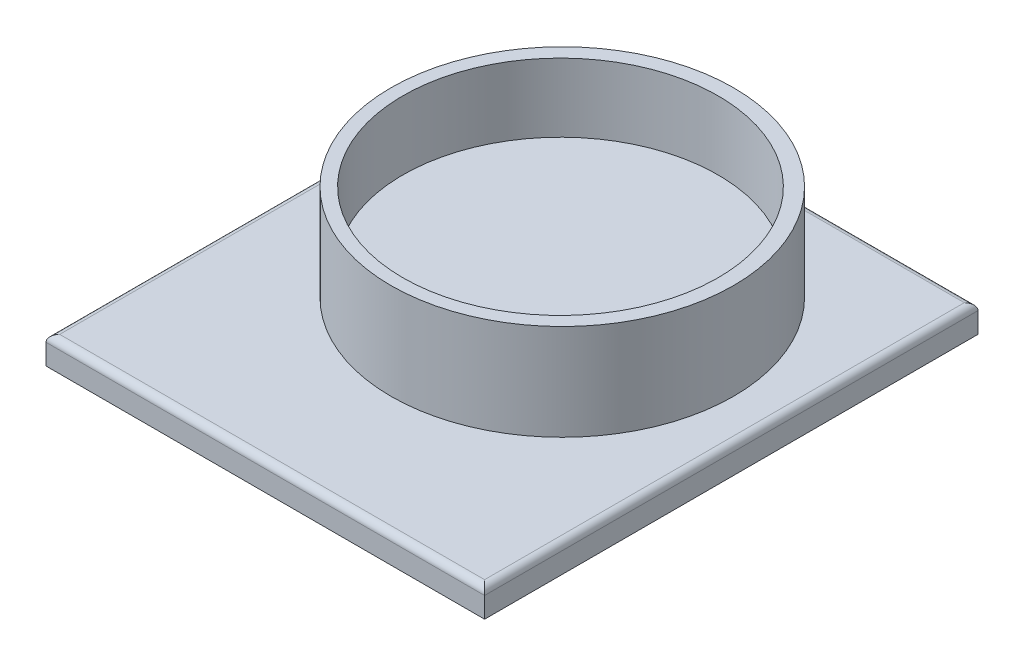
ISO-10303-21;
HEADER;
FILE_DESCRIPTION(('STEP AP214'),'2;1');
FILE_NAME('part.step','',(''),(''),'','','');
FILE_SCHEMA(('AUTOMOTIVE_DESIGN { 1 0 10303 214 1 1 1 1 }'));
ENDSEC;
DATA;
#1=APPLICATION_CONTEXT('core data for automotive mechanical design processes');
#2=APPLICATION_PROTOCOL_DEFINITION('international standard','automotive_design',2000,#1);
#3=PRODUCT_CONTEXT('',#1,'mechanical');
#4=PRODUCT('Part','Part','',(#3));
#5=PRODUCT_RELATED_PRODUCT_CATEGORY('part','',(#4));
#6=PRODUCT_DEFINITION_FORMATION('','',#4);
#7=PRODUCT_DEFINITION_CONTEXT('part definition',#1,'design');
#8=PRODUCT_DEFINITION('design','',#6,#7);
#9=PRODUCT_DEFINITION_SHAPE('','',#8);
#10=(LENGTH_UNIT() NAMED_UNIT(*) SI_UNIT(.MILLI.,.METRE.));
#11=(NAMED_UNIT(*) PLANE_ANGLE_UNIT() SI_UNIT($,.RADIAN.));
#12=(NAMED_UNIT(*) SI_UNIT($,.STERADIAN.) SOLID_ANGLE_UNIT());
#13=UNCERTAINTY_MEASURE_WITH_UNIT(LENGTH_MEASURE(1.E-05),#10,'distance_accuracy_value','');
#14=(GEOMETRIC_REPRESENTATION_CONTEXT(3) GLOBAL_UNCERTAINTY_ASSIGNED_CONTEXT((#13)) GLOBAL_UNIT_ASSIGNED_CONTEXT((#10,
#11,#12)) REPRESENTATION_CONTEXT('',''));
#15=CARTESIAN_POINT('',(0.,0.,0.));
#16=DIRECTION('',(0.,0.,1.));
#17=DIRECTION('',(1.,0.,0.));
#18=AXIS2_PLACEMENT_3D('',#15,#16,#17);
#19=CARTESIAN_POINT('',(0.,2.,0.));
#20=DIRECTION('',(1.,0.,0.));
#21=DIRECTION('',(0.,0.,-1.));
#22=AXIS2_PLACEMENT_3D('',#19,#20,#21);
#23=PLANE('',#22);
#24=DIRECTION('',(0.,-1.,0.));
#25=VECTOR('',#24,1.);
#26=CARTESIAN_POINT('',(0.,2.,0.));
#27=LINE('',#26,#25);
#28=CARTESIAN_POINT('',(0.,1.5,0.));
#29=VERTEX_POINT('',#28);
#30=CARTESIAN_POINT('',(0.,0.,0.));
#31=VERTEX_POINT('',#30);
#32=EDGE_CURVE('E87',#29,#31,#27,.T.);
#33=ORIENTED_EDGE('',*,*,#32,.F.);
#34=DIRECTION('',(0.,0.,1.));
#35=VECTOR('',#34,1.);
#36=CARTESIAN_POINT('',(0.,1.5,0.));
#37=LINE('',#36,#35);
#38=CARTESIAN_POINT('',(0.,1.5,-36.));
#39=VERTEX_POINT('',#38);
#40=EDGE_CURVE('E43',#29,#39,#37,.F.);
#41=ORIENTED_EDGE('',*,*,#40,.T.);
#42=DIRECTION('',(0.,-1.,0.));
#43=VECTOR('',#42,1.);
#44=CARTESIAN_POINT('',(0.,2.,-36.));
#45=LINE('',#44,#43);
#46=CARTESIAN_POINT('',(0.,0.,-36.));
#47=VERTEX_POINT('',#46);
#48=EDGE_CURVE('E107',#39,#47,#45,.T.);
#49=ORIENTED_EDGE('',*,*,#48,.T.);
#50=DIRECTION('',(0.,0.,1.));
#51=VECTOR('',#50,1.);
#52=CARTESIAN_POINT('',(0.,0.,0.));
#53=LINE('',#52,#51);
#54=EDGE_CURVE('E102',#47,#31,#53,.T.);
#55=ORIENTED_EDGE('',*,*,#54,.T.);
#56=EDGE_LOOP('',(#33,#41,#49,#55));
#57=FACE_BOUND('',#56,.T.);
#58=ADVANCED_FACE('F35',(#57),#23,.F.);
#59=CARTESIAN_POINT('',(0.,2.,0.));
#60=DIRECTION('',(0.,0.,-1.));
#61=DIRECTION('',(-1.,0.,0.));
#62=AXIS2_PLACEMENT_3D('',#59,#60,#61);
#63=PLANE('',#62);
#64=DIRECTION('',(0.,-1.,0.));
#65=VECTOR('',#64,1.);
#66=CARTESIAN_POINT('',(32.,2.,0.));
#67=LINE('',#66,#65);
#68=CARTESIAN_POINT('',(32.,1.5,0.));
#69=VERTEX_POINT('',#68);
#70=CARTESIAN_POINT('',(32.,0.,0.));
#71=VERTEX_POINT('',#70);
#72=EDGE_CURVE('E96',#69,#71,#67,.T.);
#73=ORIENTED_EDGE('',*,*,#72,.F.);
#74=DIRECTION('',(1.,0.,0.));
#75=VECTOR('',#74,1.);
#76=CARTESIAN_POINT('',(0.,1.5,0.));
#77=LINE('',#76,#75);
#78=EDGE_CURVE('E50',#69,#29,#77,.F.);
#79=ORIENTED_EDGE('',*,*,#78,.T.);
#80=ORIENTED_EDGE('',*,*,#32,.T.);
#81=DIRECTION('',(1.,0.,0.));
#82=VECTOR('',#81,1.);
#83=CARTESIAN_POINT('',(0.,0.,0.));
#84=LINE('',#83,#82);
#85=EDGE_CURVE('E90',#31,#71,#84,.T.);
#86=ORIENTED_EDGE('',*,*,#85,.T.);
#87=EDGE_LOOP('',(#73,#79,#80,#86));
#88=FACE_BOUND('',#87,.T.);
#89=ADVANCED_FACE('F89',(#88),#63,.F.);
#90=CARTESIAN_POINT('',(32.,2.,0.));
#91=DIRECTION('',(-1.,0.,0.));
#92=DIRECTION('',(0.,0.,1.));
#93=AXIS2_PLACEMENT_3D('',#90,#91,#92);
#94=PLANE('',#93);
#95=DIRECTION('',(0.,-1.,0.));
#96=VECTOR('',#95,1.);
#97=CARTESIAN_POINT('',(32.,2.,-36.));
#98=LINE('',#97,#96);
#99=CARTESIAN_POINT('',(32.,1.5,-36.));
#100=VERTEX_POINT('',#99);
#101=CARTESIAN_POINT('',(32.,0.,-36.));
#102=VERTEX_POINT('',#101);
#103=EDGE_CURVE('E121',#100,#102,#98,.T.);
#104=ORIENTED_EDGE('',*,*,#103,.F.);
#105=DIRECTION('',(0.,0.,-1.));
#106=VECTOR('',#105,1.);
#107=CARTESIAN_POINT('',(32.,1.5,0.));
#108=LINE('',#107,#106);
#109=EDGE_CURVE('E58',#100,#69,#108,.F.);
#110=ORIENTED_EDGE('',*,*,#109,.T.);
#111=ORIENTED_EDGE('',*,*,#72,.T.);
#112=DIRECTION('',(0.,0.,-1.));
#113=VECTOR('',#112,1.);
#114=CARTESIAN_POINT('',(32.,0.,0.));
#115=LINE('',#114,#113);
#116=EDGE_CURVE('E104',#71,#102,#115,.T.);
#117=ORIENTED_EDGE('',*,*,#116,.T.);
#118=EDGE_LOOP('',(#104,#110,#111,#117));
#119=FACE_BOUND('',#118,.T.);
#120=ADVANCED_FACE('F161',(#119),#94,.F.);
#121=CARTESIAN_POINT('',(0.,2.,-36.));
#122=DIRECTION('',(0.,0.,1.));
#123=DIRECTION('',(1.,0.,0.));
#124=AXIS2_PLACEMENT_3D('',#121,#122,#123);
#125=PLANE('',#124);
#126=ORIENTED_EDGE('',*,*,#48,.F.);
#127=DIRECTION('',(-1.,0.,0.));
#128=VECTOR('',#127,1.);
#129=CARTESIAN_POINT('',(0.,1.5,-36.));
#130=LINE('',#129,#128);
#131=EDGE_CURVE('E132',#39,#100,#130,.F.);
#132=ORIENTED_EDGE('',*,*,#131,.T.);
#133=ORIENTED_EDGE('',*,*,#103,.T.);
#134=DIRECTION('',(-1.,0.,0.));
#135=VECTOR('',#134,1.);
#136=CARTESIAN_POINT('',(0.,0.,-36.));
#137=LINE('',#136,#135);
#138=EDGE_CURVE('E118',#102,#47,#137,.T.);
#139=ORIENTED_EDGE('',*,*,#138,.T.);
#140=EDGE_LOOP('',(#126,#132,#133,#139));
#141=FACE_BOUND('',#140,.T.);
#142=ADVANCED_FACE('F160',(#141),#125,.F.);
#143=CARTESIAN_POINT('',(0.,2.,0.));
#144=DIRECTION('',(0.,-1.,0.));
#145=DIRECTION('',(0.,0.,-1.));
#146=AXIS2_PLACEMENT_3D('',#143,#144,#145);
#147=PLANE('',#146);
#148=CARTESIAN_POINT('',(16.5,2.,-21.1679025671907));
#149=DIRECTION('',(0.,-1.,0.));
#150=DIRECTION('',(0.,0.,-1.));
#151=AXIS2_PLACEMENT_3D('',#148,#149,#150);
#152=CIRCLE('',#151,12.5);
#153=CARTESIAN_POINT('',(16.5,2.,-33.6679025671907));
#154=VERTEX_POINT('',#153);
#155=EDGE_CURVE('E11',#154,#154,#152,.F.);
#156=ORIENTED_EDGE('',*,*,#155,.F.);
#157=EDGE_LOOP('',(#156));
#158=FACE_BOUND('',#157,.T.);
#159=DIRECTION('',(0.,0.,-1.));
#160=VECTOR('',#159,1.);
#161=CARTESIAN_POINT('',(31.5,2.,0.));
#162=LINE('',#161,#160);
#163=CARTESIAN_POINT('',(31.5,2.,-0.5));
#164=VERTEX_POINT('',#163);
#165=CARTESIAN_POINT('',(31.5,2.,-35.5));
#166=VERTEX_POINT('',#165);
#167=EDGE_CURVE('E127',#164,#166,#162,.T.);
#168=ORIENTED_EDGE('',*,*,#167,.T.);
#169=DIRECTION('',(-1.,0.,0.));
#170=VECTOR('',#169,1.);
#171=CARTESIAN_POINT('',(0.,2.,-35.5));
#172=LINE('',#171,#170);
#173=CARTESIAN_POINT('',(0.5,2.,-35.5));
#174=VERTEX_POINT('',#173);
#175=EDGE_CURVE('E129',#166,#174,#172,.T.);
#176=ORIENTED_EDGE('',*,*,#175,.T.);
#177=DIRECTION('',(0.,0.,1.));
#178=VECTOR('',#177,1.);
#179=CARTESIAN_POINT('',(0.5,2.,0.));
#180=LINE('',#179,#178);
#181=CARTESIAN_POINT('',(0.5,2.,-0.5));
#182=VERTEX_POINT('',#181);
#183=EDGE_CURVE('E95',#174,#182,#180,.T.);
#184=ORIENTED_EDGE('',*,*,#183,.T.);
#185=DIRECTION('',(1.,0.,0.));
#186=VECTOR('',#185,1.);
#187=CARTESIAN_POINT('',(0.,2.,-0.5));
#188=LINE('',#187,#186);
#189=EDGE_CURVE('E125',#182,#164,#188,.T.);
#190=ORIENTED_EDGE('',*,*,#189,.T.);
#191=EDGE_LOOP('',(#168,#176,#184,#190));
#192=FACE_BOUND('',#191,.T.);
#193=ADVANCED_FACE('F153',(#158,#192),#147,.F.);
#194=CARTESIAN_POINT('',(0.,0.,0.));
#195=DIRECTION('',(0.,-1.,0.));
#196=DIRECTION('',(0.,0.,-1.));
#197=AXIS2_PLACEMENT_3D('',#194,#195,#196);
#198=PLANE('',#197);
#199=ORIENTED_EDGE('',*,*,#54,.F.);
#200=ORIENTED_EDGE('',*,*,#138,.F.);
#201=ORIENTED_EDGE('',*,*,#116,.F.);
#202=ORIENTED_EDGE('',*,*,#85,.F.);
#203=EDGE_LOOP('',(#199,#200,#201,#202));
#204=FACE_BOUND('',#203,.T.);
#205=ADVANCED_FACE('F100',(#204),#198,.T.);
#206=CARTESIAN_POINT('',(0.,1.5,-0.5));
#207=DIRECTION('',(1.,0.,0.));
#208=DIRECTION('',(0.,0.,-1.));
#209=AXIS2_PLACEMENT_3D('',#206,#207,#208);
#210=CYLINDRICAL_SURFACE('',#209,0.5);
#211=CARTESIAN_POINT('',(0.5,1.5,-0.5));
#212=DIRECTION('',(0.707106781186547,0.,0.707106781186547));
#213=DIRECTION('',(-0.707106781186547,0.,0.707106781186547));
#214=AXIS2_PLACEMENT_3D('',#211,#212,#213);
#215=ELLIPSE('',#214,0.707106781186547,0.5);
#216=EDGE_CURVE('E112',#29,#182,#215,.F.);
#217=ORIENTED_EDGE('',*,*,#216,.F.);
#218=ORIENTED_EDGE('',*,*,#78,.F.);
#219=CARTESIAN_POINT('',(31.5,1.5,-0.5));
#220=DIRECTION('',(0.707106781186547,0.,-0.707106781186547));
#221=DIRECTION('',(0.707106781186547,0.,0.707106781186547));
#222=AXIS2_PLACEMENT_3D('',#219,#220,#221);
#223=ELLIPSE('',#222,0.707106781186547,0.5);
#224=EDGE_CURVE('E109',#164,#69,#223,.T.);
#225=ORIENTED_EDGE('',*,*,#224,.F.);
#226=ORIENTED_EDGE('',*,*,#189,.F.);
#227=EDGE_LOOP('',(#217,#218,#225,#226));
#228=FACE_BOUND('',#227,.T.);
#229=ADVANCED_FACE('F37',(#228),#210,.T.);
#230=CARTESIAN_POINT('',(31.5,1.5,0.));
#231=DIRECTION('',(0.,0.,-1.));
#232=DIRECTION('',(-1.,0.,0.));
#233=AXIS2_PLACEMENT_3D('',#230,#231,#232);
#234=CYLINDRICAL_SURFACE('',#233,0.5);
#235=ORIENTED_EDGE('',*,*,#224,.T.);
#236=ORIENTED_EDGE('',*,*,#109,.F.);
#237=CARTESIAN_POINT('',(31.5,1.5,-35.5));
#238=DIRECTION('',(-0.707106781186547,0.,-0.707106781186547));
#239=DIRECTION('',(0.707106781186547,0.,-0.707106781186547));
#240=AXIS2_PLACEMENT_3D('',#237,#238,#239);
#241=ELLIPSE('',#240,0.707106781186547,0.5);
#242=EDGE_CURVE('E140',#166,#100,#241,.T.);
#243=ORIENTED_EDGE('',*,*,#242,.F.);
#244=ORIENTED_EDGE('',*,*,#167,.F.);
#245=EDGE_LOOP('',(#235,#236,#243,#244));
#246=FACE_BOUND('',#245,.T.);
#247=ADVANCED_FACE('F179',(#246),#234,.T.);
#248=CARTESIAN_POINT('',(0.5,1.5,0.));
#249=DIRECTION('',(0.,0.,1.));
#250=DIRECTION('',(1.,0.,0.));
#251=AXIS2_PLACEMENT_3D('',#248,#249,#250);
#252=CYLINDRICAL_SURFACE('',#251,0.5);
#253=ORIENTED_EDGE('',*,*,#216,.T.);
#254=ORIENTED_EDGE('',*,*,#183,.F.);
#255=CARTESIAN_POINT('',(0.5,1.5,-35.5));
#256=DIRECTION('',(-0.707106781186547,0.,0.707106781186547));
#257=DIRECTION('',(0.707106781186547,0.,0.707106781186547));
#258=AXIS2_PLACEMENT_3D('',#255,#256,#257);
#259=ELLIPSE('',#258,0.707106781186547,0.5);
#260=EDGE_CURVE('E138',#39,#174,#259,.F.);
#261=ORIENTED_EDGE('',*,*,#260,.F.);
#262=ORIENTED_EDGE('',*,*,#40,.F.);
#263=EDGE_LOOP('',(#253,#254,#261,#262));
#264=FACE_BOUND('',#263,.T.);
#265=ADVANCED_FACE('F146',(#264),#252,.T.);
#266=CARTESIAN_POINT('',(0.,1.5,-35.5));
#267=DIRECTION('',(-1.,0.,0.));
#268=DIRECTION('',(0.,0.,1.));
#269=AXIS2_PLACEMENT_3D('',#266,#267,#268);
#270=CYLINDRICAL_SURFACE('',#269,0.5);
#271=ORIENTED_EDGE('',*,*,#242,.T.);
#272=ORIENTED_EDGE('',*,*,#131,.F.);
#273=ORIENTED_EDGE('',*,*,#260,.T.);
#274=ORIENTED_EDGE('',*,*,#175,.F.);
#275=EDGE_LOOP('',(#271,#272,#273,#274));
#276=FACE_BOUND('',#275,.T.);
#277=ADVANCED_FACE('F157',(#276),#270,.T.);
#278=CARTESIAN_POINT('',(16.5,9.,-21.1679025671907));
#279=DIRECTION('',(0.,-1.,0.));
#280=DIRECTION('',(0.,0.,-1.));
#281=AXIS2_PLACEMENT_3D('',#278,#279,#280);
#282=CYLINDRICAL_SURFACE('',#281,12.5);
#283=CARTESIAN_POINT('',(16.5,9.,-21.1679025671907));
#284=DIRECTION('',(0.,1.,0.));
#285=DIRECTION('',(0.,0.,1.));
#286=AXIS2_PLACEMENT_3D('',#283,#284,#285);
#287=CIRCLE('',#286,12.5);
#288=CARTESIAN_POINT('',(16.5,9.,-8.6679025671907));
#289=VERTEX_POINT('',#288);
#290=EDGE_CURVE('E114',#289,#289,#287,.T.);
#291=ORIENTED_EDGE('',*,*,#290,.F.);
#292=EDGE_LOOP('',(#291));
#293=FACE_BOUND('',#292,.T.);
#294=ORIENTED_EDGE('',*,*,#155,.T.);
#295=EDGE_LOOP('',(#294));
#296=FACE_BOUND('',#295,.T.);
#297=ADVANCED_FACE('F177',(#293,#296),#282,.T.);
#298=CARTESIAN_POINT('',(16.5,9.,-21.1679025671907));
#299=DIRECTION('',(0.,1.,0.));
#300=DIRECTION('',(0.,0.,1.));
#301=AXIS2_PLACEMENT_3D('',#298,#299,#300);
#302=PLANE('',#301);
#303=CARTESIAN_POINT('',(16.442109052307,9.,-21.0947633661488));
#304=DIRECTION('',(0.,1.,0.));
#305=DIRECTION('',(0.,0.,1.));
#306=AXIS2_PLACEMENT_3D('',#303,#304,#305);
#307=CIRCLE('',#306,11.5);
#308=CARTESIAN_POINT('',(16.442109052307,9.,-9.59476336614884));
#309=VERTEX_POINT('',#308);
#310=EDGE_CURVE('E215',#309,#309,#307,.T.);
#311=ORIENTED_EDGE('',*,*,#310,.F.);
#312=EDGE_LOOP('',(#311));
#313=FACE_BOUND('',#312,.T.);
#314=ORIENTED_EDGE('',*,*,#290,.T.);
#315=EDGE_LOOP('',(#314));
#316=FACE_BOUND('',#315,.T.);
#317=ADVANCED_FACE('F198',(#313,#316),#302,.T.);
#318=CARTESIAN_POINT('',(16.442109052307,4.,-21.0947633661488));
#319=DIRECTION('',(0.,1.,0.));
#320=DIRECTION('',(0.,0.,1.));
#321=AXIS2_PLACEMENT_3D('',#318,#319,#320);
#322=CYLINDRICAL_SURFACE('',#321,11.5);
#323=CARTESIAN_POINT('',(16.442109052307,4.,-21.0947633661488));
#324=DIRECTION('',(0.,1.,0.));
#325=DIRECTION('',(0.,0.,1.));
#326=AXIS2_PLACEMENT_3D('',#323,#324,#325);
#327=CIRCLE('',#326,11.5);
#328=CARTESIAN_POINT('',(16.442109052307,4.,-9.59476336614884));
#329=VERTEX_POINT('',#328);
#330=EDGE_CURVE('E214',#329,#329,#327,.T.);
#331=ORIENTED_EDGE('',*,*,#330,.F.);
#332=EDGE_LOOP('',(#331));
#333=FACE_BOUND('',#332,.T.);
#334=ORIENTED_EDGE('',*,*,#310,.T.);
#335=EDGE_LOOP('',(#334));
#336=FACE_BOUND('',#335,.T.);
#337=ADVANCED_FACE('F202',(#333,#336),#322,.F.);
#338=CARTESIAN_POINT('',(16.442109052307,4.,-21.0947633661488));
#339=DIRECTION('',(0.,1.,0.));
#340=DIRECTION('',(0.,0.,1.));
#341=AXIS2_PLACEMENT_3D('',#338,#339,#340);
#342=PLANE('',#341);
#343=ORIENTED_EDGE('',*,*,#330,.T.);
#344=EDGE_LOOP('',(#343));
#345=FACE_BOUND('',#344,.T.);
#346=ADVANCED_FACE('F206',(#345),#342,.T.);
#347=CLOSED_SHELL('',(#58,#89,#120,#142,#193,#205,#229,#247,#265,#277,#297,#317,#337,#346));
#348=MANIFOLD_SOLID_BREP('B2',#347);
#349=ADVANCED_BREP_SHAPE_REPRESENTATION('',(#18,#348),#14);
#350=SHAPE_DEFINITION_REPRESENTATION(#9,#349);
ENDSEC;
END-ISO-10303-21;
